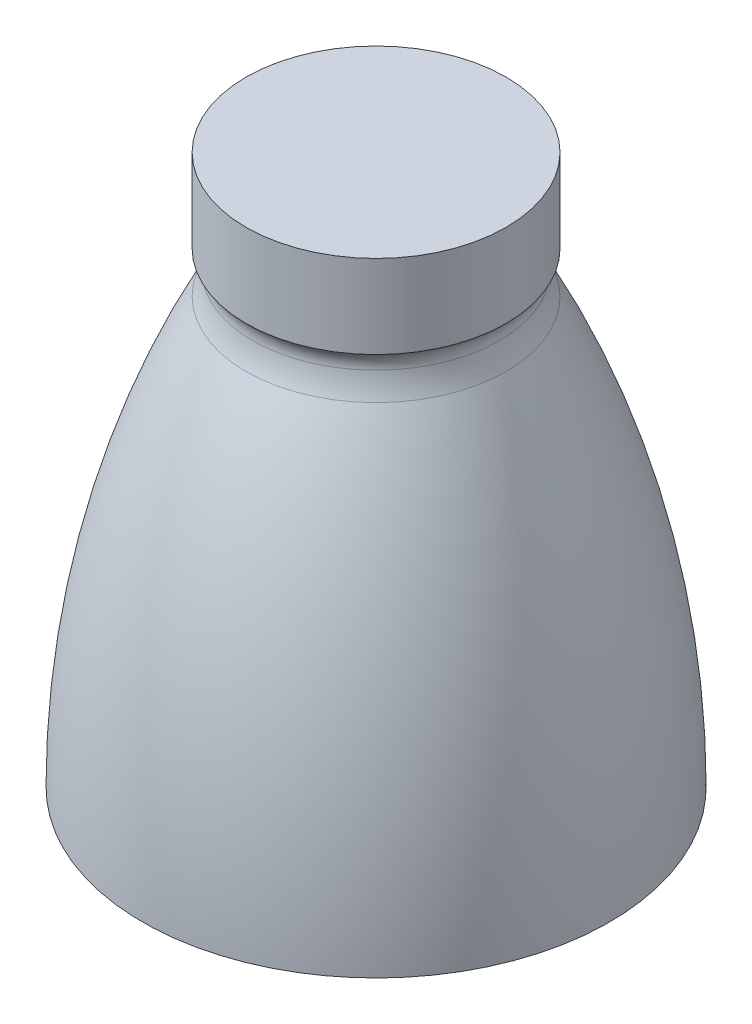
ISO-10303-21;
HEADER;
FILE_DESCRIPTION(('STEP AP214'),'2;1');
FILE_NAME('part.step','',(''),(''),'','','');
FILE_SCHEMA(('AUTOMOTIVE_DESIGN { 1 0 10303 214 1 1 1 1 }'));
ENDSEC;
DATA;
#1=APPLICATION_CONTEXT('core data for automotive mechanical design processes');
#2=APPLICATION_PROTOCOL_DEFINITION('international standard','automotive_design',2000,#1);
#3=PRODUCT_CONTEXT('',#1,'mechanical');
#4=PRODUCT('Part','Part','',(#3));
#5=PRODUCT_RELATED_PRODUCT_CATEGORY('part','',(#4));
#6=PRODUCT_DEFINITION_FORMATION('','',#4);
#7=PRODUCT_DEFINITION_CONTEXT('part definition',#1,'design');
#8=PRODUCT_DEFINITION('design','',#6,#7);
#9=PRODUCT_DEFINITION_SHAPE('','',#8);
#10=(LENGTH_UNIT() NAMED_UNIT(*) SI_UNIT(.MILLI.,.METRE.));
#11=(NAMED_UNIT(*) PLANE_ANGLE_UNIT() SI_UNIT($,.RADIAN.));
#12=(NAMED_UNIT(*) SI_UNIT($,.STERADIAN.) SOLID_ANGLE_UNIT());
#13=UNCERTAINTY_MEASURE_WITH_UNIT(LENGTH_MEASURE(1.E-05),#10,'distance_accuracy_value','');
#14=(GEOMETRIC_REPRESENTATION_CONTEXT(3) GLOBAL_UNCERTAINTY_ASSIGNED_CONTEXT((#13)) GLOBAL_UNIT_ASSIGNED_CONTEXT((#10,
#11,#12)) REPRESENTATION_CONTEXT('',''));
#15=CARTESIAN_POINT('',(0.,0.,0.));
#16=DIRECTION('',(0.,0.,1.));
#17=DIRECTION('',(1.,0.,0.));
#18=AXIS2_PLACEMENT_3D('',#15,#16,#17);
#19=CARTESIAN_POINT('',(0.,-10.2135370887184,0.));
#20=DIRECTION('',(0.,-1.,0.));
#21=DIRECTION('',(0.,0.,-1.));
#22=AXIS2_PLACEMENT_3D('',#19,#20,#21);
#23=DEGENERATE_TOROIDAL_SURFACE('',#22,16.6585533925596,22.264440812625,.F.);
#24=CARTESIAN_POINT('',(0.,0.,0.));
#25=DIRECTION('',(0.,-1.,0.));
#26=DIRECTION('',(0.,0.,-1.));
#27=AXIS2_PLACEMENT_3D('',#24,#25,#26);
#28=CIRCLE('',#27,3.125);
#29=CARTESIAN_POINT('',(0.,0.,-3.125));
#30=VERTEX_POINT('',#29);
#31=EDGE_CURVE('E51',#30,#30,#28,.T.);
#32=ORIENTED_EDGE('',*,*,#31,.T.);
#33=EDGE_LOOP('',(#32));
#34=FACE_BOUND('',#33,.T.);
#35=CARTESIAN_POINT('',(0.,-10.2135370887184,0.));
#36=DIRECTION('',(0.,-1.,0.));
#37=DIRECTION('',(0.,0.,-1.));
#38=AXIS2_PLACEMENT_3D('',#35,#36,#37);
#39=CIRCLE('',#38,5.60588742006542);
#40=CARTESIAN_POINT('',(0.,-10.2135370887184,-5.60588742006542));
#41=VERTEX_POINT('',#40);
#42=EDGE_CURVE('E67',#41,#41,#39,.T.);
#43=ORIENTED_EDGE('',*,*,#42,.F.);
#44=EDGE_LOOP('',(#43));
#45=FACE_BOUND('',#44,.T.);
#46=ADVANCED_FACE('F43',(#34,#45),#23,.F.);
#47=CARTESIAN_POINT('',(0.,-10.2135370887184,0.));
#48=DIRECTION('',(0.,-1.,0.));
#49=DIRECTION('',(0.,0.,-1.));
#50=AXIS2_PLACEMENT_3D('',#47,#48,#49);
#51=DEGENERATE_TOROIDAL_SURFACE('',#50,18.4520941917062,23.570221681877,.F.);
#52=CARTESIAN_POINT('',(0.,-10.2135370887184,0.));
#53=DIRECTION('',(0.,-1.,0.));
#54=DIRECTION('',(0.,0.,-1.));
#55=AXIS2_PLACEMENT_3D('',#52,#53,#54);
#56=CIRCLE('',#55,5.11812749017082);
#57=CARTESIAN_POINT('',(0.,-10.2135370887184,-5.11812749017082));
#58=VERTEX_POINT('',#57);
#59=EDGE_CURVE('E61',#58,#58,#56,.T.);
#60=ORIENTED_EDGE('',*,*,#59,.T.);
#61=EDGE_LOOP('',(#60));
#62=FACE_BOUND('',#61,.T.);
#63=CARTESIAN_POINT('',(0.,0.,0.));
#64=DIRECTION('',(0.,-1.,0.));
#65=DIRECTION('',(0.,0.,-1.));
#66=AXIS2_PLACEMENT_3D('',#63,#64,#65);
#67=CIRCLE('',#66,2.79029292156804);
#68=CARTESIAN_POINT('',(0.,0.,-2.79029292156804));
#69=VERTEX_POINT('',#68);
#70=EDGE_CURVE('E56',#69,#69,#67,.T.);
#71=ORIENTED_EDGE('',*,*,#70,.F.);
#72=EDGE_LOOP('',(#71));
#73=FACE_BOUND('',#72,.T.);
#74=ADVANCED_FACE('F96',(#62,#73),#51,.T.);
#75=CARTESIAN_POINT('',(5.60588742006542,-10.2135370887184,0.));
#76=DIRECTION('',(0.,-1.,0.));
#77=DIRECTION('',(0.,0.,-1.));
#78=AXIS2_PLACEMENT_3D('',#75,#76,#77);
#79=PLANE('',#78);
#80=ORIENTED_EDGE('',*,*,#42,.T.);
#81=EDGE_LOOP('',(#80));
#82=FACE_BOUND('',#81,.T.);
#83=ORIENTED_EDGE('',*,*,#59,.F.);
#84=EDGE_LOOP('',(#83));
#85=FACE_BOUND('',#84,.T.);
#86=ADVANCED_FACE('F101',(#82,#85),#79,.T.);
#87=CARTESIAN_POINT('',(0.,0.,0.));
#88=DIRECTION('',(0.,1.,0.));
#89=DIRECTION('',(0.,0.,1.));
#90=AXIS2_PLACEMENT_3D('',#87,#88,#89);
#91=PLANE('',#90);
#92=ORIENTED_EDGE('',*,*,#70,.T.);
#93=EDGE_LOOP('',(#92));
#94=FACE_BOUND('',#93,.T.);
#95=ADVANCED_FACE('F85',(#94),#91,.F.);
#96=CARTESIAN_POINT('',(0.,3.,0.));
#97=DIRECTION('',(0.,-1.,0.));
#98=DIRECTION('',(0.,0.,-1.));
#99=AXIS2_PLACEMENT_3D('',#96,#97,#98);
#100=CYLINDRICAL_SURFACE('',#99,3.125);
#101=CARTESIAN_POINT('',(0.,3.,0.));
#102=DIRECTION('',(0.,1.,0.));
#103=DIRECTION('',(0.,0.,1.));
#104=AXIS2_PLACEMENT_3D('',#101,#102,#103);
#105=CIRCLE('',#104,3.125);
#106=CARTESIAN_POINT('',(0.,3.,3.125));
#107=VERTEX_POINT('',#106);
#108=EDGE_CURVE('E71',#107,#107,#105,.T.);
#109=ORIENTED_EDGE('',*,*,#108,.F.);
#110=EDGE_LOOP('',(#109));
#111=FACE_BOUND('',#110,.T.);
#112=CARTESIAN_POINT('',(0.,1.,0.));
#113=DIRECTION('',(0.,1.,0.));
#114=DIRECTION('',(0.,0.,1.));
#115=AXIS2_PLACEMENT_3D('',#112,#113,#114);
#116=CIRCLE('',#115,3.125);
#117=CARTESIAN_POINT('',(0.,1.,3.125));
#118=VERTEX_POINT('',#117);
#119=EDGE_CURVE('E72',#118,#118,#116,.T.);
#120=ORIENTED_EDGE('',*,*,#119,.T.);
#121=EDGE_LOOP('',(#120));
#122=FACE_BOUND('',#121,.T.);
#123=ADVANCED_FACE('F82',(#111,#122),#100,.T.);
#124=CARTESIAN_POINT('',(0.,3.,0.));
#125=DIRECTION('',(0.,1.,0.));
#126=DIRECTION('',(0.,0.,1.));
#127=AXIS2_PLACEMENT_3D('',#124,#125,#126);
#128=PLANE('',#127);
#129=ORIENTED_EDGE('',*,*,#108,.T.);
#130=EDGE_LOOP('',(#129));
#131=FACE_BOUND('',#130,.T.);
#132=ADVANCED_FACE('F80',(#131),#128,.T.);
#133=CARTESIAN_POINT('',(0.,0.828871730755259,0.));
#134=DIRECTION('',(0.,-1.,0.));
#135=DIRECTION('',(0.,0.,-1.));
#136=AXIS2_PLACEMENT_3D('',#133,#134,#135);
#137=TOROIDAL_SURFACE('',#136,4.94515704101454,2.);
#138=CARTESIAN_POINT('',(0.,0.560592459608475,0.));
#139=DIRECTION('',(0.,1.,0.));
#140=DIRECTION('',(0.,0.,1.));
#141=AXIS2_PLACEMENT_3D('',#138,#139,#140);
#142=CIRCLE('',#141,2.96323216033087);
#143=CARTESIAN_POINT('',(0.,0.560592459608475,2.96323216033087));
#144=VERTEX_POINT('',#143);
#145=EDGE_CURVE('E10',#144,#144,#142,.F.);
#146=ORIENTED_EDGE('',*,*,#145,.T.);
#147=EDGE_LOOP('',(#146));
#148=FACE_BOUND('',#147,.T.);
#149=ORIENTED_EDGE('',*,*,#31,.F.);
#150=EDGE_LOOP('',(#149));
#151=FACE_BOUND('',#150,.T.);
#152=ADVANCED_FACE('F90',(#148,#151),#137,.F.);
#153=CARTESIAN_POINT('',(0.,0.627662277395153,0.));
#154=DIRECTION('',(0.,1.,0.));
#155=DIRECTION('',(0.,0.,1.));
#156=AXIS2_PLACEMENT_3D('',#153,#154,#155);
#157=TOROIDAL_SURFACE('',#156,3.45871338050165,0.5);
#158=ORIENTED_EDGE('',*,*,#145,.F.);
#159=EDGE_LOOP('',(#158));
#160=FACE_BOUND('',#159,.T.);
#161=ORIENTED_EDGE('',*,*,#119,.F.);
#162=EDGE_LOOP('',(#161));
#163=FACE_BOUND('',#162,.T.);
#164=ADVANCED_FACE('F45',(#160,#163),#157,.F.);
#165=CLOSED_SHELL('',(#46,#74,#86,#95,#123,#132,#152,#164));
#166=MANIFOLD_SOLID_BREP('B2',#165);
#167=ADVANCED_BREP_SHAPE_REPRESENTATION('',(#18,#166),#14);
#168=SHAPE_DEFINITION_REPRESENTATION(#9,#167);
ENDSEC;
END-ISO-10303-21;
